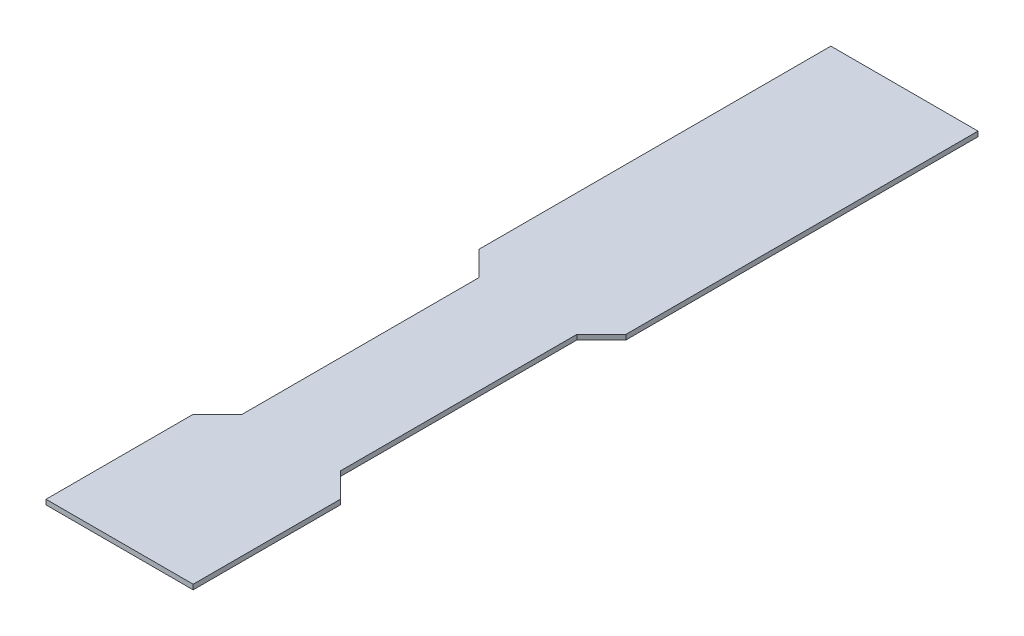
ISO-10303-21;
HEADER;
FILE_DESCRIPTION(('STEP AP214'),'2;1');
FILE_NAME('part.step','',(''),(''),'','','');
FILE_SCHEMA(('AUTOMOTIVE_DESIGN { 1 0 10303 214 1 1 1 1 }'));
ENDSEC;
DATA;
#1=APPLICATION_CONTEXT('core data for automotive mechanical design processes');
#2=APPLICATION_PROTOCOL_DEFINITION('international standard','automotive_design',2000,#1);
#3=PRODUCT_CONTEXT('',#1,'mechanical');
#4=PRODUCT('Part','Part','',(#3));
#5=PRODUCT_RELATED_PRODUCT_CATEGORY('part','',(#4));
#6=PRODUCT_DEFINITION_FORMATION('','',#4);
#7=PRODUCT_DEFINITION_CONTEXT('part definition',#1,'design');
#8=PRODUCT_DEFINITION('design','',#6,#7);
#9=PRODUCT_DEFINITION_SHAPE('','',#8);
#10=(LENGTH_UNIT() NAMED_UNIT(*) SI_UNIT(.MILLI.,.METRE.));
#11=(NAMED_UNIT(*) PLANE_ANGLE_UNIT() SI_UNIT($,.RADIAN.));
#12=(NAMED_UNIT(*) SI_UNIT($,.STERADIAN.) SOLID_ANGLE_UNIT());
#13=UNCERTAINTY_MEASURE_WITH_UNIT(LENGTH_MEASURE(1.E-05),#10,'distance_accuracy_value','');
#14=(GEOMETRIC_REPRESENTATION_CONTEXT(3) GLOBAL_UNCERTAINTY_ASSIGNED_CONTEXT((#13)) GLOBAL_UNIT_ASSIGNED_CONTEXT((#10,
#11,#12)) REPRESENTATION_CONTEXT('',''));
#15=CARTESIAN_POINT('',(0.,0.,0.));
#16=DIRECTION('',(0.,0.,1.));
#17=DIRECTION('',(1.,0.,0.));
#18=AXIS2_PLACEMENT_3D('',#15,#16,#17);
#19=CARTESIAN_POINT('',(-30.0000000000001,2.,260.));
#20=DIRECTION('',(0.707106781186549,0.,0.707106781186546));
#21=DIRECTION('',(0.707106781186546,0.,-0.707106781186549));
#22=AXIS2_PLACEMENT_3D('',#19,#20,#21);
#23=PLANE('',#22);
#24=DIRECTION('',(-0.707106781186546,0.,0.707106781186549));
#25=VECTOR('',#24,1.);
#26=CARTESIAN_POINT('',(-30.0000000000001,0.,260.));
#27=LINE('',#26,#25);
#28=CARTESIAN_POINT('',(-20.,0.,250.));
#29=VERTEX_POINT('',#28);
#30=CARTESIAN_POINT('',(-30.0000000000001,0.,260.));
#31=VERTEX_POINT('',#30);
#32=EDGE_CURVE('E168',#29,#31,#27,.T.);
#33=ORIENTED_EDGE('',*,*,#32,.T.);
#34=DIRECTION('',(0.,-1.,0.));
#35=VECTOR('',#34,1.);
#36=CARTESIAN_POINT('',(-30.0000000000001,2.,260.));
#37=LINE('',#36,#35);
#38=CARTESIAN_POINT('',(-30.0000000000001,2.,260.));
#39=VERTEX_POINT('',#38);
#40=EDGE_CURVE('E48',#39,#31,#37,.T.);
#41=ORIENTED_EDGE('',*,*,#40,.F.);
#42=DIRECTION('',(-0.707106781186546,0.,0.707106781186549));
#43=VECTOR('',#42,1.);
#44=CARTESIAN_POINT('',(-30.0000000000001,2.,260.));
#45=LINE('',#44,#43);
#46=CARTESIAN_POINT('',(-20.,2.,250.));
#47=VERTEX_POINT('',#46);
#48=EDGE_CURVE('E112',#47,#39,#45,.T.);
#49=ORIENTED_EDGE('',*,*,#48,.F.);
#50=DIRECTION('',(0.,-1.,0.));
#51=VECTOR('',#50,1.);
#52=CARTESIAN_POINT('',(-20.,2.,250.));
#53=LINE('',#52,#51);
#54=EDGE_CURVE('E11',#47,#29,#53,.T.);
#55=ORIENTED_EDGE('',*,*,#54,.T.);
#56=EDGE_LOOP('',(#33,#41,#49,#55));
#57=FACE_BOUND('',#56,.T.);
#58=ADVANCED_FACE('F39',(#57),#23,.F.);
#59=CARTESIAN_POINT('',(-30.0000000000001,2.,260.));
#60=DIRECTION('',(1.,0.,0.));
#61=DIRECTION('',(0.,0.,-1.));
#62=AXIS2_PLACEMENT_3D('',#59,#60,#61);
#63=PLANE('',#62);
#64=DIRECTION('',(0.,0.,1.));
#65=VECTOR('',#64,1.);
#66=CARTESIAN_POINT('',(-30.0000000000001,0.,260.));
#67=LINE('',#66,#65);
#68=CARTESIAN_POINT('',(-30.,0.,320.));
#69=VERTEX_POINT('',#68);
#70=EDGE_CURVE('E171',#31,#69,#67,.T.);
#71=ORIENTED_EDGE('',*,*,#70,.T.);
#72=DIRECTION('',(0.,-1.,0.));
#73=VECTOR('',#72,1.);
#74=CARTESIAN_POINT('',(-30.,2.,320.));
#75=LINE('',#74,#73);
#76=CARTESIAN_POINT('',(-30.,2.,320.));
#77=VERTEX_POINT('',#76);
#78=EDGE_CURVE('E228',#77,#69,#75,.T.);
#79=ORIENTED_EDGE('',*,*,#78,.F.);
#80=DIRECTION('',(0.,0.,1.));
#81=VECTOR('',#80,1.);
#82=CARTESIAN_POINT('',(-30.0000000000001,2.,260.));
#83=LINE('',#82,#81);
#84=EDGE_CURVE('E238',#39,#77,#83,.T.);
#85=ORIENTED_EDGE('',*,*,#84,.F.);
#86=ORIENTED_EDGE('',*,*,#40,.T.);
#87=EDGE_LOOP('',(#71,#79,#85,#86));
#88=FACE_BOUND('',#87,.T.);
#89=ADVANCED_FACE('F236',(#88),#63,.F.);
#90=CARTESIAN_POINT('',(-30.,2.,320.));
#91=DIRECTION('',(0.,0.,-1.));
#92=DIRECTION('',(-1.,0.,0.));
#93=AXIS2_PLACEMENT_3D('',#90,#91,#92);
#94=PLANE('',#93);
#95=DIRECTION('',(1.,0.,0.));
#96=VECTOR('',#95,1.);
#97=CARTESIAN_POINT('',(-30.,0.,320.));
#98=LINE('',#97,#96);
#99=CARTESIAN_POINT('',(30.,0.,320.));
#100=VERTEX_POINT('',#99);
#101=EDGE_CURVE('E174',#69,#100,#98,.T.);
#102=ORIENTED_EDGE('',*,*,#101,.T.);
#103=DIRECTION('',(0.,-1.,0.));
#104=VECTOR('',#103,1.);
#105=CARTESIAN_POINT('',(30.,2.,320.));
#106=LINE('',#105,#104);
#107=CARTESIAN_POINT('',(30.,2.,320.));
#108=VERTEX_POINT('',#107);
#109=EDGE_CURVE('E224',#108,#100,#106,.T.);
#110=ORIENTED_EDGE('',*,*,#109,.F.);
#111=DIRECTION('',(1.,0.,0.));
#112=VECTOR('',#111,1.);
#113=CARTESIAN_POINT('',(-30.,2.,320.));
#114=LINE('',#113,#112);
#115=EDGE_CURVE('E258',#77,#108,#114,.T.);
#116=ORIENTED_EDGE('',*,*,#115,.F.);
#117=ORIENTED_EDGE('',*,*,#78,.T.);
#118=EDGE_LOOP('',(#102,#110,#116,#117));
#119=FACE_BOUND('',#118,.T.);
#120=ADVANCED_FACE('F248',(#119),#94,.F.);
#121=CARTESIAN_POINT('',(30.0000000000001,2.,260.));
#122=DIRECTION('',(-1.,0.,0.));
#123=DIRECTION('',(0.,0.,1.));
#124=AXIS2_PLACEMENT_3D('',#121,#122,#123);
#125=PLANE('',#124);
#126=DIRECTION('',(0.,0.,-1.));
#127=VECTOR('',#126,1.);
#128=CARTESIAN_POINT('',(30.0000000000001,0.,260.));
#129=LINE('',#128,#127);
#130=CARTESIAN_POINT('',(30.0000000000001,0.,260.));
#131=VERTEX_POINT('',#130);
#132=EDGE_CURVE('E177',#100,#131,#129,.T.);
#133=ORIENTED_EDGE('',*,*,#132,.T.);
#134=DIRECTION('',(0.,-1.,0.));
#135=VECTOR('',#134,1.);
#136=CARTESIAN_POINT('',(30.0000000000001,2.,260.));
#137=LINE('',#136,#135);
#138=CARTESIAN_POINT('',(30.0000000000001,2.,260.));
#139=VERTEX_POINT('',#138);
#140=EDGE_CURVE('E220',#139,#131,#137,.T.);
#141=ORIENTED_EDGE('',*,*,#140,.F.);
#142=DIRECTION('',(0.,0.,-1.));
#143=VECTOR('',#142,1.);
#144=CARTESIAN_POINT('',(30.0000000000001,2.,260.));
#145=LINE('',#144,#143);
#146=EDGE_CURVE('E254',#108,#139,#145,.T.);
#147=ORIENTED_EDGE('',*,*,#146,.F.);
#148=ORIENTED_EDGE('',*,*,#109,.T.);
#149=EDGE_LOOP('',(#133,#141,#147,#148));
#150=FACE_BOUND('',#149,.T.);
#151=ADVANCED_FACE('F252',(#150),#125,.F.);
#152=CARTESIAN_POINT('',(30.0000000000001,2.,260.));
#153=DIRECTION('',(-0.707106781186549,0.,0.707106781186546));
#154=DIRECTION('',(0.707106781186546,0.,0.707106781186549));
#155=AXIS2_PLACEMENT_3D('',#152,#153,#154);
#156=PLANE('',#155);
#157=DIRECTION('',(-0.707106781186546,0.,-0.707106781186549));
#158=VECTOR('',#157,1.);
#159=CARTESIAN_POINT('',(30.0000000000001,0.,260.));
#160=LINE('',#159,#158);
#161=CARTESIAN_POINT('',(20.,0.,250.));
#162=VERTEX_POINT('',#161);
#163=EDGE_CURVE('E180',#131,#162,#160,.T.);
#164=ORIENTED_EDGE('',*,*,#163,.T.);
#165=DIRECTION('',(0.,-1.,0.));
#166=VECTOR('',#165,1.);
#167=CARTESIAN_POINT('',(20.,2.,250.));
#168=LINE('',#167,#166);
#169=CARTESIAN_POINT('',(20.,2.,250.));
#170=VERTEX_POINT('',#169);
#171=EDGE_CURVE('E216',#170,#162,#168,.T.);
#172=ORIENTED_EDGE('',*,*,#171,.F.);
#173=DIRECTION('',(-0.707106781186546,0.,-0.707106781186549));
#174=VECTOR('',#173,1.);
#175=CARTESIAN_POINT('',(30.0000000000001,2.,260.));
#176=LINE('',#175,#174);
#177=EDGE_CURVE('E257',#139,#170,#176,.T.);
#178=ORIENTED_EDGE('',*,*,#177,.F.);
#179=ORIENTED_EDGE('',*,*,#140,.T.);
#180=EDGE_LOOP('',(#164,#172,#178,#179));
#181=FACE_BOUND('',#180,.T.);
#182=ADVANCED_FACE('F308',(#181),#156,.F.);
#183=CARTESIAN_POINT('',(20.,2.,240.));
#184=DIRECTION('',(-1.,0.,0.));
#185=DIRECTION('',(0.,0.,1.));
#186=AXIS2_PLACEMENT_3D('',#183,#184,#185);
#187=PLANE('',#186);
#188=DIRECTION('',(0.,0.,-1.));
#189=VECTOR('',#188,1.);
#190=CARTESIAN_POINT('',(20.,0.,240.));
#191=LINE('',#190,#189);
#192=CARTESIAN_POINT('',(20.,0.,153.5));
#193=VERTEX_POINT('',#192);
#194=EDGE_CURVE('E184',#162,#193,#191,.T.);
#195=ORIENTED_EDGE('',*,*,#194,.T.);
#196=DIRECTION('',(0.,-1.,0.));
#197=VECTOR('',#196,1.);
#198=CARTESIAN_POINT('',(20.,2.,153.5));
#199=LINE('',#198,#197);
#200=CARTESIAN_POINT('',(20.,2.,153.5));
#201=VERTEX_POINT('',#200);
#202=EDGE_CURVE('E212',#201,#193,#199,.T.);
#203=ORIENTED_EDGE('',*,*,#202,.F.);
#204=DIRECTION('',(0.,0.,-1.));
#205=VECTOR('',#204,1.);
#206=CARTESIAN_POINT('',(20.,2.,250.));
#207=LINE('',#206,#205);
#208=EDGE_CURVE('E262',#170,#201,#207,.T.);
#209=ORIENTED_EDGE('',*,*,#208,.F.);
#210=ORIENTED_EDGE('',*,*,#171,.T.);
#211=EDGE_LOOP('',(#195,#203,#209,#210));
#212=FACE_BOUND('',#211,.T.);
#213=ADVANCED_FACE('F311',(#212),#187,.F.);
#214=CARTESIAN_POINT('',(30.,2.,143.5));
#215=DIRECTION('',(-0.707106781186539,0.,-0.707106781186556));
#216=DIRECTION('',(-0.707106781186556,0.,0.707106781186539));
#217=AXIS2_PLACEMENT_3D('',#214,#215,#216);
#218=PLANE('',#217);
#219=DIRECTION('',(0.707106781186556,0.,-0.707106781186539));
#220=VECTOR('',#219,1.);
#221=CARTESIAN_POINT('',(30.,0.,143.5));
#222=LINE('',#221,#220);
#223=CARTESIAN_POINT('',(30.,0.,143.5));
#224=VERTEX_POINT('',#223);
#225=EDGE_CURVE('E187',#193,#224,#222,.T.);
#226=ORIENTED_EDGE('',*,*,#225,.T.);
#227=DIRECTION('',(0.,-1.,0.));
#228=VECTOR('',#227,1.);
#229=CARTESIAN_POINT('',(30.,2.,143.5));
#230=LINE('',#229,#228);
#231=CARTESIAN_POINT('',(30.,2.,143.5));
#232=VERTEX_POINT('',#231);
#233=EDGE_CURVE('E208',#232,#224,#230,.T.);
#234=ORIENTED_EDGE('',*,*,#233,.F.);
#235=DIRECTION('',(0.707106781186556,0.,-0.707106781186539));
#236=VECTOR('',#235,1.);
#237=CARTESIAN_POINT('',(30.,2.,143.5));
#238=LINE('',#237,#236);
#239=EDGE_CURVE('E269',#201,#232,#238,.T.);
#240=ORIENTED_EDGE('',*,*,#239,.F.);
#241=ORIENTED_EDGE('',*,*,#202,.T.);
#242=EDGE_LOOP('',(#226,#234,#240,#241));
#243=FACE_BOUND('',#242,.T.);
#244=ADVANCED_FACE('F277',(#243),#218,.F.);
#245=CARTESIAN_POINT('',(30.,2.,143.5));
#246=DIRECTION('',(-1.,0.,0.));
#247=DIRECTION('',(0.,0.,1.));
#248=AXIS2_PLACEMENT_3D('',#245,#246,#247);
#249=PLANE('',#248);
#250=DIRECTION('',(0.,0.,-1.));
#251=VECTOR('',#250,1.);
#252=CARTESIAN_POINT('',(30.,0.,143.5));
#253=LINE('',#252,#251);
#254=CARTESIAN_POINT('',(30.,0.,0.));
#255=VERTEX_POINT('',#254);
#256=EDGE_CURVE('E190',#224,#255,#253,.T.);
#257=ORIENTED_EDGE('',*,*,#256,.T.);
#258=DIRECTION('',(0.,-1.,0.));
#259=VECTOR('',#258,1.);
#260=CARTESIAN_POINT('',(30.,2.,0.));
#261=LINE('',#260,#259);
#262=CARTESIAN_POINT('',(30.,2.,0.));
#263=VERTEX_POINT('',#262);
#264=EDGE_CURVE('E155',#263,#255,#261,.T.);
#265=ORIENTED_EDGE('',*,*,#264,.F.);
#266=DIRECTION('',(0.,0.,-1.));
#267=VECTOR('',#266,1.);
#268=CARTESIAN_POINT('',(30.,2.,143.5));
#269=LINE('',#268,#267);
#270=EDGE_CURVE('E144',#232,#263,#269,.T.);
#271=ORIENTED_EDGE('',*,*,#270,.F.);
#272=ORIENTED_EDGE('',*,*,#233,.T.);
#273=EDGE_LOOP('',(#257,#265,#271,#272));
#274=FACE_BOUND('',#273,.T.);
#275=ADVANCED_FACE('F281',(#274),#249,.F.);
#276=CARTESIAN_POINT('',(-30.,2.,0.));
#277=DIRECTION('',(0.,0.,1.));
#278=DIRECTION('',(1.,0.,0.));
#279=AXIS2_PLACEMENT_3D('',#276,#277,#278);
#280=PLANE('',#279);
#281=DIRECTION('',(-1.,0.,0.));
#282=VECTOR('',#281,1.);
#283=CARTESIAN_POINT('',(-30.,0.,0.));
#284=LINE('',#283,#282);
#285=CARTESIAN_POINT('',(-30.,0.,0.));
#286=VERTEX_POINT('',#285);
#287=EDGE_CURVE('E153',#255,#286,#284,.T.);
#288=ORIENTED_EDGE('',*,*,#287,.T.);
#289=DIRECTION('',(0.,-1.,0.));
#290=VECTOR('',#289,1.);
#291=CARTESIAN_POINT('',(-30.,2.,0.));
#292=LINE('',#291,#290);
#293=CARTESIAN_POINT('',(-30.,2.,0.));
#294=VERTEX_POINT('',#293);
#295=EDGE_CURVE('E150',#294,#286,#292,.T.);
#296=ORIENTED_EDGE('',*,*,#295,.F.);
#297=DIRECTION('',(-1.,0.,0.));
#298=VECTOR('',#297,1.);
#299=CARTESIAN_POINT('',(-30.,2.,0.));
#300=LINE('',#299,#298);
#301=EDGE_CURVE('E138',#263,#294,#300,.T.);
#302=ORIENTED_EDGE('',*,*,#301,.F.);
#303=ORIENTED_EDGE('',*,*,#264,.T.);
#304=EDGE_LOOP('',(#288,#296,#302,#303));
#305=FACE_BOUND('',#304,.T.);
#306=ADVANCED_FACE('F151',(#305),#280,.F.);
#307=CARTESIAN_POINT('',(-30.,2.,143.5));
#308=DIRECTION('',(1.,0.,0.));
#309=DIRECTION('',(0.,0.,-1.));
#310=AXIS2_PLACEMENT_3D('',#307,#308,#309);
#311=PLANE('',#310);
#312=DIRECTION('',(0.,0.,1.));
#313=VECTOR('',#312,1.);
#314=CARTESIAN_POINT('',(-30.,0.,143.5));
#315=LINE('',#314,#313);
#316=CARTESIAN_POINT('',(-30.,0.,143.5));
#317=VERTEX_POINT('',#316);
#318=EDGE_CURVE('E98',#286,#317,#315,.T.);
#319=ORIENTED_EDGE('',*,*,#318,.T.);
#320=DIRECTION('',(0.,-1.,0.));
#321=VECTOR('',#320,1.);
#322=CARTESIAN_POINT('',(-30.,2.,143.5));
#323=LINE('',#322,#321);
#324=CARTESIAN_POINT('',(-30.,2.,143.5));
#325=VERTEX_POINT('',#324);
#326=EDGE_CURVE('E156',#325,#317,#323,.T.);
#327=ORIENTED_EDGE('',*,*,#326,.F.);
#328=DIRECTION('',(0.,0.,1.));
#329=VECTOR('',#328,1.);
#330=CARTESIAN_POINT('',(-30.,2.,143.5));
#331=LINE('',#330,#329);
#332=EDGE_CURVE('E142',#294,#325,#331,.T.);
#333=ORIENTED_EDGE('',*,*,#332,.F.);
#334=ORIENTED_EDGE('',*,*,#295,.T.);
#335=EDGE_LOOP('',(#319,#327,#333,#334));
#336=FACE_BOUND('',#335,.T.);
#337=ADVANCED_FACE('F158',(#336),#311,.F.);
#338=CARTESIAN_POINT('',(-30.,2.,143.5));
#339=DIRECTION('',(0.707106781186539,0.,-0.707106781186556));
#340=DIRECTION('',(-0.707106781186556,0.,-0.707106781186539));
#341=AXIS2_PLACEMENT_3D('',#338,#339,#340);
#342=PLANE('',#341);
#343=DIRECTION('',(0.707106781186556,0.,0.707106781186539));
#344=VECTOR('',#343,1.);
#345=CARTESIAN_POINT('',(-30.,0.,143.5));
#346=LINE('',#345,#344);
#347=CARTESIAN_POINT('',(-20.,0.,153.5));
#348=VERTEX_POINT('',#347);
#349=EDGE_CURVE('E105',#317,#348,#346,.T.);
#350=ORIENTED_EDGE('',*,*,#349,.T.);
#351=DIRECTION('',(0.,-1.,0.));
#352=VECTOR('',#351,1.);
#353=CARTESIAN_POINT('',(-20.,2.,153.5));
#354=LINE('',#353,#352);
#355=CARTESIAN_POINT('',(-20.,2.,153.5));
#356=VERTEX_POINT('',#355);
#357=EDGE_CURVE('E164',#356,#348,#354,.T.);
#358=ORIENTED_EDGE('',*,*,#357,.F.);
#359=DIRECTION('',(0.707106781186556,0.,0.707106781186539));
#360=VECTOR('',#359,1.);
#361=CARTESIAN_POINT('',(-30.,2.,143.5));
#362=LINE('',#361,#360);
#363=EDGE_CURVE('E161',#325,#356,#362,.T.);
#364=ORIENTED_EDGE('',*,*,#363,.F.);
#365=ORIENTED_EDGE('',*,*,#326,.T.);
#366=EDGE_LOOP('',(#350,#358,#364,#365));
#367=FACE_BOUND('',#366,.T.);
#368=ADVANCED_FACE('F283',(#367),#342,.F.);
#369=CARTESIAN_POINT('',(-20.,2.,240.));
#370=DIRECTION('',(1.,0.,0.));
#371=DIRECTION('',(0.,0.,-1.));
#372=AXIS2_PLACEMENT_3D('',#369,#370,#371);
#373=PLANE('',#372);
#374=DIRECTION('',(0.,0.,1.));
#375=VECTOR('',#374,1.);
#376=CARTESIAN_POINT('',(-20.,0.,240.));
#377=LINE('',#376,#375);
#378=EDGE_CURVE('E199',#348,#29,#377,.T.);
#379=ORIENTED_EDGE('',*,*,#378,.T.);
#380=ORIENTED_EDGE('',*,*,#54,.F.);
#381=DIRECTION('',(0.,0.,1.));
#382=VECTOR('',#381,1.);
#383=CARTESIAN_POINT('',(-20.,2.,250.));
#384=LINE('',#383,#382);
#385=EDGE_CURVE('E56',#356,#47,#384,.T.);
#386=ORIENTED_EDGE('',*,*,#385,.F.);
#387=ORIENTED_EDGE('',*,*,#357,.T.);
#388=EDGE_LOOP('',(#379,#380,#386,#387));
#389=FACE_BOUND('',#388,.T.);
#390=ADVANCED_FACE('F282',(#389),#373,.F.);
#391=CARTESIAN_POINT('',(0.,2.,0.));
#392=DIRECTION('',(0.,-1.,0.));
#393=DIRECTION('',(0.,0.,-1.));
#394=AXIS2_PLACEMENT_3D('',#391,#392,#393);
#395=PLANE('',#394);
#396=ORIENTED_EDGE('',*,*,#385,.T.);
#397=ORIENTED_EDGE('',*,*,#48,.T.);
#398=ORIENTED_EDGE('',*,*,#84,.T.);
#399=ORIENTED_EDGE('',*,*,#115,.T.);
#400=ORIENTED_EDGE('',*,*,#146,.T.);
#401=ORIENTED_EDGE('',*,*,#177,.T.);
#402=ORIENTED_EDGE('',*,*,#208,.T.);
#403=ORIENTED_EDGE('',*,*,#239,.T.);
#404=ORIENTED_EDGE('',*,*,#270,.T.);
#405=ORIENTED_EDGE('',*,*,#301,.T.);
#406=ORIENTED_EDGE('',*,*,#332,.T.);
#407=ORIENTED_EDGE('',*,*,#363,.T.);
#408=EDGE_LOOP('',(#396,#397,#398,#399,#400,#401,#402,#403,#404,#405,#406,#407));
#409=FACE_BOUND('',#408,.T.);
#410=ADVANCED_FACE('F140',(#409),#395,.F.);
#411=CARTESIAN_POINT('',(0.,0.,0.));
#412=DIRECTION('',(0.,-1.,0.));
#413=DIRECTION('',(0.,0.,-1.));
#414=AXIS2_PLACEMENT_3D('',#411,#412,#413);
#415=PLANE('',#414);
#416=ORIENTED_EDGE('',*,*,#32,.F.);
#417=ORIENTED_EDGE('',*,*,#378,.F.);
#418=ORIENTED_EDGE('',*,*,#349,.F.);
#419=ORIENTED_EDGE('',*,*,#318,.F.);
#420=ORIENTED_EDGE('',*,*,#287,.F.);
#421=ORIENTED_EDGE('',*,*,#256,.F.);
#422=ORIENTED_EDGE('',*,*,#225,.F.);
#423=ORIENTED_EDGE('',*,*,#194,.F.);
#424=ORIENTED_EDGE('',*,*,#163,.F.);
#425=ORIENTED_EDGE('',*,*,#132,.F.);
#426=ORIENTED_EDGE('',*,*,#101,.F.);
#427=ORIENTED_EDGE('',*,*,#70,.F.);
#428=EDGE_LOOP('',(#416,#417,#418,#419,#420,#421,#422,#423,#424,#425,#426,#427));
#429=FACE_BOUND('',#428,.T.);
#430=ADVANCED_FACE('F242',(#429),#415,.T.);
#431=CLOSED_SHELL('',(#58,#89,#120,#151,#182,#213,#244,#275,#306,#337,#368,#390,#410,#430));
#432=MANIFOLD_SOLID_BREP('B2',#431);
#433=ADVANCED_BREP_SHAPE_REPRESENTATION('',(#18,#432),#14);
#434=SHAPE_DEFINITION_REPRESENTATION(#9,#433);
ENDSEC;
END-ISO-10303-21;
